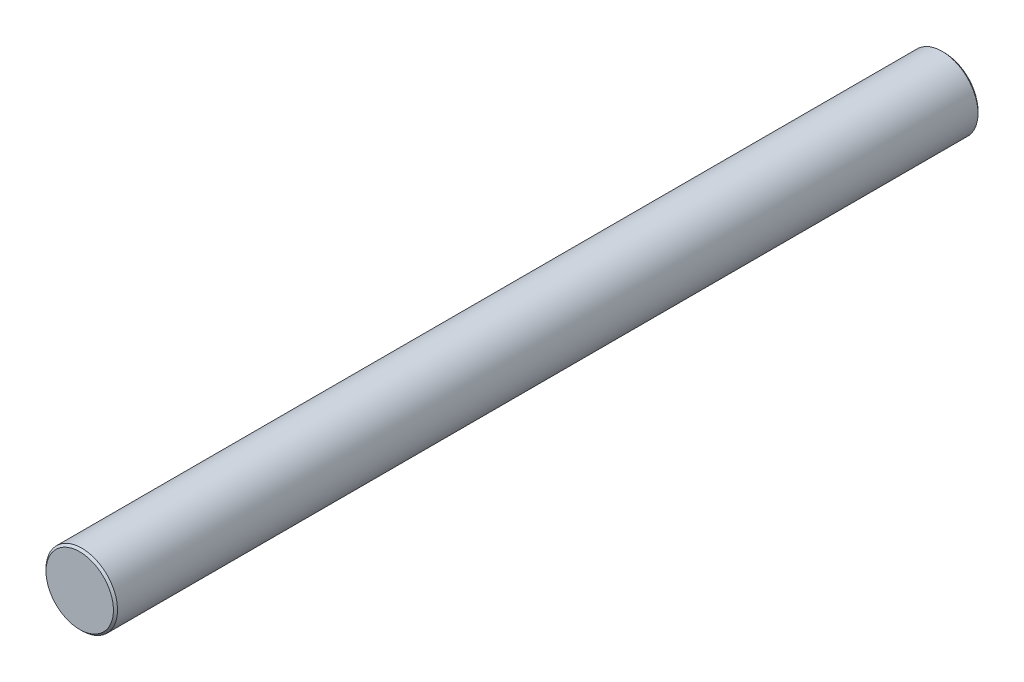
ISO-10303-21;
HEADER;
FILE_DESCRIPTION(('STEP AP214'),'2;1');
FILE_NAME('part.step','',(''),(''),'','','');
FILE_SCHEMA(('AUTOMOTIVE_DESIGN { 1 0 10303 214 1 1 1 1 }'));
ENDSEC;
DATA;
#1=APPLICATION_CONTEXT('core data for automotive mechanical design processes');
#2=APPLICATION_PROTOCOL_DEFINITION('international standard','automotive_design',2000,#1);
#3=PRODUCT_CONTEXT('',#1,'mechanical');
#4=PRODUCT('Part','Part','',(#3));
#5=PRODUCT_RELATED_PRODUCT_CATEGORY('part','',(#4));
#6=PRODUCT_DEFINITION_FORMATION('','',#4);
#7=PRODUCT_DEFINITION_CONTEXT('part definition',#1,'design');
#8=PRODUCT_DEFINITION('design','',#6,#7);
#9=PRODUCT_DEFINITION_SHAPE('','',#8);
#10=(LENGTH_UNIT() NAMED_UNIT(*) SI_UNIT(.MILLI.,.METRE.));
#11=(NAMED_UNIT(*) PLANE_ANGLE_UNIT() SI_UNIT($,.RADIAN.));
#12=(NAMED_UNIT(*) SI_UNIT($,.STERADIAN.) SOLID_ANGLE_UNIT());
#13=UNCERTAINTY_MEASURE_WITH_UNIT(LENGTH_MEASURE(1.E-05),#10,'distance_accuracy_value','');
#14=(GEOMETRIC_REPRESENTATION_CONTEXT(3) GLOBAL_UNCERTAINTY_ASSIGNED_CONTEXT((#13)) GLOBAL_UNIT_ASSIGNED_CONTEXT((#10,
#11,#12)) REPRESENTATION_CONTEXT('',''));
#15=CARTESIAN_POINT('',(0.,0.,0.));
#16=DIRECTION('',(0.,0.,1.));
#17=DIRECTION('',(1.,0.,0.));
#18=AXIS2_PLACEMENT_3D('',#15,#16,#17);
#19=CARTESIAN_POINT('',(0.,0.,42.));
#20=DIRECTION('',(0.,0.,-1.));
#21=DIRECTION('',(-1.,0.,0.));
#22=AXIS2_PLACEMENT_3D('',#19,#20,#21);
#23=CYLINDRICAL_SURFACE('',#22,3.475);
#24=CARTESIAN_POINT('',(0.,0.,41.8000000000001));
#25=DIRECTION('',(0.,0.,1.));
#26=DIRECTION('',(1.,0.,0.));
#27=AXIS2_PLACEMENT_3D('',#24,#25,#26);
#28=CIRCLE('',#27,3.475);
#29=CARTESIAN_POINT('',(-3.475,0.,41.8000000000001));
#30=VERTEX_POINT('',#29);
#31=EDGE_CURVE('E54',#30,#30,#28,.F.);
#32=CARTESIAN_POINT('',(0.,0.,-41.7999999999999));
#33=DIRECTION('',(0.,0.,1.));
#34=DIRECTION('',(1.,0.,0.));
#35=AXIS2_PLACEMENT_3D('',#32,#33,#34);
#36=CIRCLE('',#35,3.475);
#37=CARTESIAN_POINT('',(-3.475,0.,-41.7999999999999));
#38=VERTEX_POINT('',#37);
#39=EDGE_CURVE('E59',#38,#38,#36,.T.);
#40=CARTESIAN_POINT('',(-3.475,0.,41.8000000000001));
#41=CARTESIAN_POINT('',(-3.475,0.,40.9291666666667));
#42=CARTESIAN_POINT('',(-3.475,0.,40.0583333333334));
#43=CARTESIAN_POINT('',(-3.475,0.,38.3166666666667));
#44=CARTESIAN_POINT('',(-3.475,0.,37.4458333333334));
#45=CARTESIAN_POINT('',(-3.475,0.,35.7041666666667));
#46=CARTESIAN_POINT('',(-3.475,0.,34.8333333333334));
#47=CARTESIAN_POINT('',(-3.475,0.,33.0916666666667));
#48=CARTESIAN_POINT('',(-3.475,0.,32.2208333333334));
#49=CARTESIAN_POINT('',(-3.475,0.,30.4791666666667));
#50=CARTESIAN_POINT('',(-3.475,0.,29.6083333333334));
#51=CARTESIAN_POINT('',(-3.475,0.,27.8666666666667));
#52=CARTESIAN_POINT('',(-3.475,0.,26.9958333333334));
#53=CARTESIAN_POINT('',(-3.475,0.,25.2541666666667));
#54=CARTESIAN_POINT('',(-3.475,0.,24.3833333333334));
#55=CARTESIAN_POINT('',(-3.475,0.,22.6416666666667));
#56=CARTESIAN_POINT('',(-3.475,0.,21.7708333333334));
#57=CARTESIAN_POINT('',(-3.475,0.,20.0291666666667));
#58=CARTESIAN_POINT('',(-3.475,0.,19.1583333333334));
#59=CARTESIAN_POINT('',(-3.475,0.,17.4166666666667));
#60=CARTESIAN_POINT('',(-3.475,0.,16.5458333333334));
#61=CARTESIAN_POINT('',(-3.475,0.,14.8041666666667));
#62=CARTESIAN_POINT('',(-3.475,0.,13.9333333333334));
#63=CARTESIAN_POINT('',(-3.475,0.,12.1916666666667));
#64=CARTESIAN_POINT('',(-3.475,0.,11.3208333333334));
#65=CARTESIAN_POINT('',(-3.475,0.,9.57916666666672));
#66=CARTESIAN_POINT('',(-3.475,0.,8.70833333333339));
#67=CARTESIAN_POINT('',(-3.475,0.,6.96666666666672));
#68=CARTESIAN_POINT('',(-3.475,0.,6.09583333333338));
#69=CARTESIAN_POINT('',(-3.475,0.,4.35416666666672));
#70=CARTESIAN_POINT('',(-3.475,0.,3.48333333333339));
#71=CARTESIAN_POINT('',(-3.475,0.,1.74166666666672));
#72=CARTESIAN_POINT('',(-3.475,0.,0.87083333333339));
#73=CARTESIAN_POINT('',(-3.475,0.,-0.870833333333279));
#74=CARTESIAN_POINT('',(-3.475,0.,-1.74166666666661));
#75=CARTESIAN_POINT('',(-3.475,0.,-3.48333333333328));
#76=CARTESIAN_POINT('',(-3.475,0.,-4.35416666666662));
#77=CARTESIAN_POINT('',(-3.475,0.,-6.09583333333328));
#78=CARTESIAN_POINT('',(-3.475,0.,-6.96666666666661));
#79=CARTESIAN_POINT('',(-3.475,0.,-8.70833333333328));
#80=CARTESIAN_POINT('',(-3.475,0.,-9.57916666666661));
#81=CARTESIAN_POINT('',(-3.475,0.,-11.3208333333333));
#82=CARTESIAN_POINT('',(-3.475,0.,-12.1916666666666));
#83=CARTESIAN_POINT('',(-3.475,0.,-13.9333333333333));
#84=CARTESIAN_POINT('',(-3.475,0.,-14.8041666666666));
#85=CARTESIAN_POINT('',(-3.475,0.,-16.5458333333333));
#86=CARTESIAN_POINT('',(-3.475,0.,-17.4166666666666));
#87=CARTESIAN_POINT('',(-3.475,0.,-19.1583333333333));
#88=CARTESIAN_POINT('',(-3.475,0.,-20.0291666666666));
#89=CARTESIAN_POINT('',(-3.475,0.,-21.7708333333333));
#90=CARTESIAN_POINT('',(-3.475,0.,-22.6416666666666));
#91=CARTESIAN_POINT('',(-3.475,0.,-24.3833333333333));
#92=CARTESIAN_POINT('',(-3.475,0.,-25.2541666666666));
#93=CARTESIAN_POINT('',(-3.475,0.,-26.9958333333333));
#94=CARTESIAN_POINT('',(-3.475,0.,-27.8666666666666));
#95=CARTESIAN_POINT('',(-3.475,0.,-29.6083333333333));
#96=CARTESIAN_POINT('',(-3.475,0.,-30.4791666666666));
#97=CARTESIAN_POINT('',(-3.475,0.,-32.2208333333333));
#98=CARTESIAN_POINT('',(-3.475,0.,-33.0916666666666));
#99=CARTESIAN_POINT('',(-3.475,0.,-34.8333333333333));
#100=CARTESIAN_POINT('',(-3.475,0.,-35.7041666666666));
#101=CARTESIAN_POINT('',(-3.475,0.,-37.4458333333333));
#102=CARTESIAN_POINT('',(-3.475,0.,-38.3166666666666));
#103=CARTESIAN_POINT('',(-3.475,0.,-40.0583333333333));
#104=CARTESIAN_POINT('',(-3.475,0.,-40.9291666666666));
#105=CARTESIAN_POINT('',(-3.475,0.,-41.7999999999999));
#106=B_SPLINE_CURVE_WITH_KNOTS('',3,(#40,#41,#42,#43,#44,#45,#46,#47,#48,#49,#50,#51,#52,#53,
#54,#55,#56,#57,#58,#59,#60,#61,#62,#63,#64,#65,#66,#67,#68,#69,#70,#71,#72,#73,#74,#75,#76,#77,
#78,#79,#80,#81,#82,#83,#84,#85,#86,#87,#88,#89,#90,#91,#92,#93,#94,#95,#96,#97,#98,#99,#100,
#101,#102,#103,#104,#105),.UNSPECIFIED.,.F.,.F.,(4,2,2,2,2,2,2,2,2,2,2,2,2,2,2,2,2,2,2,2,2,2,2,
2,2,2,2,2,2,2,2,2,4),(0.,2.6125,5.225,7.8375,10.45,13.0625,15.675,18.2875,20.9,23.5125,26.125,
28.7375,31.35,33.9625,36.575,39.1875,41.8,44.4125,47.025,49.6375,52.25,54.8625,57.475,60.0875,
62.7,65.3125,67.925,70.5375,73.15,75.7625,78.375,80.9875,83.6),.UNSPECIFIED.);
#107=EDGE_CURVE('BSEAM45',#30,#38,#106,.T.);
#108=ORIENTED_EDGE('',*,*,#31,.T.);
#109=ORIENTED_EDGE('',*,*,#39,.T.);
#110=ORIENTED_EDGE('',*,*,#107,.T.);
#111=ORIENTED_EDGE('',*,*,#107,.F.);
#112=EDGE_LOOP('',(#108,#110,#109,#111));
#113=FACE_BOUND('',#112,.T.);
#114=ADVANCED_FACE('F45',(#113),#23,.T.);
#115=CARTESIAN_POINT('',(0.,0.,42.));
#116=DIRECTION('',(0.,0.,1.));
#117=DIRECTION('',(1.,0.,0.));
#118=AXIS2_PLACEMENT_3D('',#115,#116,#117);
#119=PLANE('',#118);
#120=CARTESIAN_POINT('',(0.,0.,42.));
#121=DIRECTION('',(0.,0.,1.));
#122=DIRECTION('',(1.,0.,0.));
#123=AXIS2_PLACEMENT_3D('',#120,#121,#122);
#124=CIRCLE('',#123,3.27500000000004);
#125=CARTESIAN_POINT('',(-3.27500000000004,0.,42.));
#126=VERTEX_POINT('',#125);
#127=EDGE_CURVE('E64',#126,#126,#124,.T.);
#128=ORIENTED_EDGE('',*,*,#127,.T.);
#129=EDGE_LOOP('',(#128));
#130=FACE_BOUND('',#129,.T.);
#131=ADVANCED_FACE('F71',(#130),#119,.T.);
#132=CARTESIAN_POINT('',(0.,0.,-42.));
#133=DIRECTION('',(0.,0.,1.));
#134=DIRECTION('',(1.,0.,0.));
#135=AXIS2_PLACEMENT_3D('',#132,#133,#134);
#136=PLANE('',#135);
#137=CARTESIAN_POINT('',(0.,0.,-42.));
#138=DIRECTION('',(0.,0.,1.));
#139=DIRECTION('',(1.,0.,0.));
#140=AXIS2_PLACEMENT_3D('',#137,#138,#139);
#141=CIRCLE('',#140,3.27499999999993);
#142=CARTESIAN_POINT('',(3.27499999999993,0.,-42.));
#143=VERTEX_POINT('',#142);
#144=EDGE_CURVE('E10',#143,#143,#141,.F.);
#145=ORIENTED_EDGE('',*,*,#144,.T.);
#146=EDGE_LOOP('',(#145));
#147=FACE_BOUND('',#146,.T.);
#148=ADVANCED_FACE('F75',(#147),#136,.F.);
#149=CARTESIAN_POINT('',(0.,0.,42.));
#150=DIRECTION('',(0.,0.,-1.));
#151=DIRECTION('',(-1.,0.,0.));
#152=AXIS2_PLACEMENT_3D('',#149,#150,#151);
#153=CONICAL_SURFACE('',#152,3.27500000000004,0.78539816339747);
#154=CARTESIAN_POINT('',(-3.475,0.,41.8000000000001));
#155=CARTESIAN_POINT('',(-3.47291666666667,0.,41.8020833333334));
#156=CARTESIAN_POINT('',(-3.47083333333334,0.,41.8041666666667));
#157=CARTESIAN_POINT('',(-3.46666666666667,0.,41.8083333333334));
#158=CARTESIAN_POINT('',(-3.46458333333334,0.,41.8104166666667));
#159=CARTESIAN_POINT('',(-3.46041666666667,0.,41.8145833333334));
#160=CARTESIAN_POINT('',(-3.45833333333334,0.,41.8166666666667));
#161=CARTESIAN_POINT('',(-3.45416666666667,0.,41.8208333333334));
#162=CARTESIAN_POINT('',(-3.45208333333334,0.,41.8229166666667));
#163=CARTESIAN_POINT('',(-3.44791666666668,0.,41.8270833333334));
#164=CARTESIAN_POINT('',(-3.44583333333334,0.,41.8291666666667));
#165=CARTESIAN_POINT('',(-3.44166666666668,0.,41.8333333333334));
#166=CARTESIAN_POINT('',(-3.43958333333334,0.,41.8354166666667));
#167=CARTESIAN_POINT('',(-3.43541666666668,0.,41.8395833333334));
#168=CARTESIAN_POINT('',(-3.43333333333335,0.,41.8416666666667));
#169=CARTESIAN_POINT('',(-3.42916666666668,0.,41.8458333333334));
#170=CARTESIAN_POINT('',(-3.42708333333335,0.,41.8479166666667));
#171=CARTESIAN_POINT('',(-3.42291666666668,0.,41.8520833333334));
#172=CARTESIAN_POINT('',(-3.42083333333335,0.,41.8541666666667));
#173=CARTESIAN_POINT('',(-3.41666666666668,0.,41.8583333333334));
#174=CARTESIAN_POINT('',(-3.41458333333335,0.,41.8604166666667));
#175=CARTESIAN_POINT('',(-3.41041666666668,0.,41.8645833333334));
#176=CARTESIAN_POINT('',(-3.40833333333335,0.,41.8666666666667));
#177=CARTESIAN_POINT('',(-3.40416666666668,0.,41.8708333333334));
#178=CARTESIAN_POINT('',(-3.40208333333335,0.,41.8729166666667));
#179=CARTESIAN_POINT('',(-3.39791666666669,0.,41.8770833333334));
#180=CARTESIAN_POINT('',(-3.39583333333335,0.,41.8791666666667));
#181=CARTESIAN_POINT('',(-3.39166666666669,0.,41.8833333333334));
#182=CARTESIAN_POINT('',(-3.38958333333335,0.,41.8854166666667));
#183=CARTESIAN_POINT('',(-3.38541666666669,0.,41.8895833333334));
#184=CARTESIAN_POINT('',(-3.38333333333336,0.,41.8916666666667));
#185=CARTESIAN_POINT('',(-3.37916666666669,0.,41.8958333333334));
#186=CARTESIAN_POINT('',(-3.37708333333336,0.,41.8979166666667));
#187=CARTESIAN_POINT('',(-3.37291666666669,0.,41.9020833333334));
#188=CARTESIAN_POINT('',(-3.37083333333336,0.,41.9041666666667));
#189=CARTESIAN_POINT('',(-3.36666666666669,0.,41.9083333333334));
#190=CARTESIAN_POINT('',(-3.36458333333336,0.,41.9104166666667));
#191=CARTESIAN_POINT('',(-3.36041666666669,0.,41.9145833333334));
#192=CARTESIAN_POINT('',(-3.35833333333336,0.,41.9166666666667));
#193=CARTESIAN_POINT('',(-3.35416666666669,0.,41.9208333333333));
#194=CARTESIAN_POINT('',(-3.35208333333336,0.,41.9229166666667));
#195=CARTESIAN_POINT('',(-3.3479166666667,0.,41.9270833333333));
#196=CARTESIAN_POINT('',(-3.34583333333336,0.,41.9291666666667));
#197=CARTESIAN_POINT('',(-3.3416666666667,0.,41.9333333333334));
#198=CARTESIAN_POINT('',(-3.33958333333337,0.,41.9354166666667));
#199=CARTESIAN_POINT('',(-3.3354166666667,0.,41.9395833333334));
#200=CARTESIAN_POINT('',(-3.33333333333337,0.,41.9416666666667));
#201=CARTESIAN_POINT('',(-3.3291666666667,0.,41.9458333333333));
#202=CARTESIAN_POINT('',(-3.32708333333337,0.,41.9479166666667));
#203=CARTESIAN_POINT('',(-3.3229166666667,0.,41.9520833333333));
#204=CARTESIAN_POINT('',(-3.32083333333337,0.,41.9541666666667));
#205=CARTESIAN_POINT('',(-3.3166666666667,0.,41.9583333333333));
#206=CARTESIAN_POINT('',(-3.31458333333337,0.,41.9604166666667));
#207=CARTESIAN_POINT('',(-3.3104166666667,0.,41.9645833333333));
#208=CARTESIAN_POINT('',(-3.30833333333337,0.,41.9666666666667));
#209=CARTESIAN_POINT('',(-3.30416666666671,0.,41.9708333333333));
#210=CARTESIAN_POINT('',(-3.30208333333337,0.,41.9729166666667));
#211=CARTESIAN_POINT('',(-3.29791666666671,0.,41.9770833333333));
#212=CARTESIAN_POINT('',(-3.29583333333337,0.,41.9791666666667));
#213=CARTESIAN_POINT('',(-3.29166666666671,0.,41.9833333333333));
#214=CARTESIAN_POINT('',(-3.28958333333338,0.,41.9854166666667));
#215=CARTESIAN_POINT('',(-3.28541666666671,0.,41.9895833333333));
#216=CARTESIAN_POINT('',(-3.28333333333338,0.,41.9916666666667));
#217=CARTESIAN_POINT('',(-3.27916666666671,0.,41.9958333333333));
#218=CARTESIAN_POINT('',(-3.27708333333338,0.,41.9979166666667));
#219=CARTESIAN_POINT('',(-3.27500000000004,0.,42.));
#220=B_SPLINE_CURVE_WITH_KNOTS('',3,(#154,#155,#156,#157,#158,#159,#160,#161,#162,#163,#164,
#165,#166,#167,#168,#169,#170,#171,#172,#173,#174,#175,#176,#177,#178,#179,#180,#181,#182,#183,
#184,#185,#186,#187,#188,#189,#190,#191,#192,#193,#194,#195,#196,#197,#198,#199,#200,#201,#202,
#203,#204,#205,#206,#207,#208,#209,#210,#211,#212,#213,#214,#215,#216,#217,#218,#219),
.UNSPECIFIED.,.F.,.F.,(4,2,2,2,2,2,2,2,2,2,2,2,2,2,2,2,2,2,2,2,2,2,2,2,2,2,2,2,2,2,2,2,4),(0.,
0.00883883476482566,0.0176776695296559,0.0265165042944865,0.035355339059317,0.0441941738241473,
0.0530330085889779,0.0618718433538081,0.0707106781186387,0.0795495128834643,0.0883883476482946,
0.0972271824131252,0.106066017177955,0.114904851942786,0.123743686707617,0.132582521472447,
0.141421356237277,0.150260191002103,0.159099025766933,0.167937860531764,0.176776695296594,
0.185615530061425,0.194454364826255,0.203293199591085,0.212132034355916,0.220970869120742,
0.229809703885572,0.238648538650402,0.247487373415233,0.256326208180063,0.265165042944894,
0.274003877709724,0.282842712474555),.UNSPECIFIED.);
#221=EDGE_CURVE('BSEAM73',#30,#126,#220,.T.);
#222=ORIENTED_EDGE('',*,*,#31,.F.);
#223=ORIENTED_EDGE('',*,*,#127,.F.);
#224=ORIENTED_EDGE('',*,*,#221,.T.);
#225=ORIENTED_EDGE('',*,*,#221,.F.);
#226=EDGE_LOOP('',(#222,#224,#223,#225));
#227=FACE_BOUND('',#226,.T.);
#228=ADVANCED_FACE('F73',(#227),#153,.T.);
#229=CARTESIAN_POINT('',(0.,0.,-41.7999999999999));
#230=DIRECTION('',(0.,0.,1.));
#231=DIRECTION('',(1.,0.,0.));
#232=AXIS2_PLACEMENT_3D('',#229,#230,#231);
#233=CONICAL_SURFACE('',#232,3.475,0.785398163397435);
#234=ORIENTED_EDGE('',*,*,#144,.F.);
#235=EDGE_LOOP('',(#234));
#236=FACE_BOUND('',#235,.T.);
#237=ORIENTED_EDGE('',*,*,#39,.F.);
#238=EDGE_LOOP('',(#237));
#239=FACE_BOUND('',#238,.T.);
#240=ADVANCED_FACE('F48',(#236,#239),#233,.T.);
#241=CLOSED_SHELL('',(#114,#131,#148,#228,#240));
#242=MANIFOLD_SOLID_BREP('B2',#241);
#243=ADVANCED_BREP_SHAPE_REPRESENTATION('',(#18,#242),#14);
#244=SHAPE_DEFINITION_REPRESENTATION(#9,#243);
ENDSEC;
END-ISO-10303-21;
